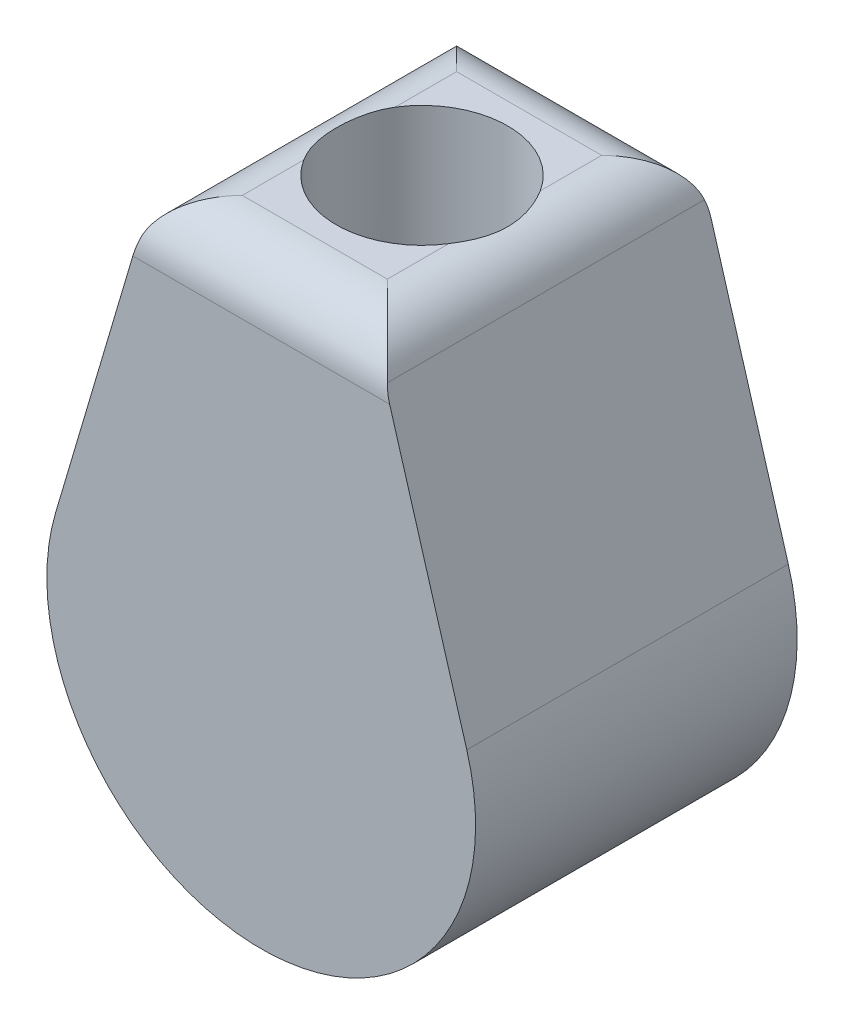
ISO-10303-21;
HEADER;
FILE_DESCRIPTION(('STEP AP214'),'2;1');
FILE_NAME('part.step','',(''),(''),'','','');
FILE_SCHEMA(('AUTOMOTIVE_DESIGN { 1 0 10303 214 1 1 1 1 }'));
ENDSEC;
DATA;
#1=APPLICATION_CONTEXT('core data for automotive mechanical design processes');
#2=APPLICATION_PROTOCOL_DEFINITION('international standard','automotive_design',2000,#1);
#3=PRODUCT_CONTEXT('',#1,'mechanical');
#4=PRODUCT('Part','Part','',(#3));
#5=PRODUCT_RELATED_PRODUCT_CATEGORY('part','',(#4));
#6=PRODUCT_DEFINITION_FORMATION('','',#4);
#7=PRODUCT_DEFINITION_CONTEXT('part definition',#1,'design');
#8=PRODUCT_DEFINITION('design','',#6,#7);
#9=PRODUCT_DEFINITION_SHAPE('','',#8);
#10=(LENGTH_UNIT() NAMED_UNIT(*) SI_UNIT(.MILLI.,.METRE.));
#11=(NAMED_UNIT(*) PLANE_ANGLE_UNIT() SI_UNIT($,.RADIAN.));
#12=(NAMED_UNIT(*) SI_UNIT($,.STERADIAN.) SOLID_ANGLE_UNIT());
#13=UNCERTAINTY_MEASURE_WITH_UNIT(LENGTH_MEASURE(1.E-05),#10,'distance_accuracy_value','');
#14=(GEOMETRIC_REPRESENTATION_CONTEXT(3) GLOBAL_UNCERTAINTY_ASSIGNED_CONTEXT((#13)) GLOBAL_UNIT_ASSIGNED_CONTEXT((#10,
#11,#12)) REPRESENTATION_CONTEXT('',''));
#15=CARTESIAN_POINT('',(0.,0.,0.));
#16=DIRECTION('',(0.,0.,1.));
#17=DIRECTION('',(1.,0.,0.));
#18=AXIS2_PLACEMENT_3D('',#15,#16,#17);
#19=CARTESIAN_POINT('',(1.6,0.,6.));
#20=DIRECTION('',(0.,-1.,0.));
#21=DIRECTION('',(1.,0.,0.));
#22=AXIS2_PLACEMENT_3D('',#19,#20,#21);
#23=PLANE('',#22);
#24=DIRECTION('',(-1.,0.,0.));
#25=VECTOR('',#24,1.);
#26=CARTESIAN_POINT('',(2.1,0.,5.));
#27=LINE('',#26,#25);
#28=CARTESIAN_POINT('',(-1.35305713878644,0.,5.));
#29=VERTEX_POINT('',#28);
#30=CARTESIAN_POINT('',(1.35305713878644,0.,5.));
#31=VERTEX_POINT('',#30);
#32=EDGE_CURVE('E189',#29,#31,#27,.F.);
#33=ORIENTED_EDGE('',*,*,#32,.T.);
#34=DIRECTION('',(0.,0.,-1.));
#35=VECTOR('',#34,1.);
#36=CARTESIAN_POINT('',(1.35305713878644,0.,6.));
#37=LINE('',#36,#35);
#38=CARTESIAN_POINT('',(1.35305713878644,0.,3.85395338232193));
#39=VERTEX_POINT('',#38);
#40=EDGE_CURVE('E193',#31,#39,#37,.T.);
#41=ORIENTED_EDGE('',*,*,#40,.T.);
#42=CARTESIAN_POINT('',(0.,0.,3.));
#43=DIRECTION('',(0.,-1.,0.));
#44=DIRECTION('',(1.,0.,0.));
#45=AXIS2_PLACEMENT_3D('',#42,#43,#44);
#46=CIRCLE('',#45,1.6);
#47=CARTESIAN_POINT('',(-1.35305713878644,0.,3.85395338232193));
#48=VERTEX_POINT('',#47);
#49=EDGE_CURVE('E159',#39,#48,#46,.T.);
#50=ORIENTED_EDGE('',*,*,#49,.T.);
#51=DIRECTION('',(0.,0.,-1.));
#52=VECTOR('',#51,1.);
#53=CARTESIAN_POINT('',(-1.35305713878644,0.,6.));
#54=LINE('',#53,#52);
#55=EDGE_CURVE('E186',#48,#29,#54,.F.);
#56=ORIENTED_EDGE('',*,*,#55,.T.);
#57=EDGE_LOOP('',(#33,#41,#50,#56));
#58=FACE_BOUND('',#57,.T.);
#59=ADVANCED_FACE('F44',(#58),#23,.F.);
#60=CARTESIAN_POINT('',(-1.6,-8.,6.));
#61=DIRECTION('',(0.,-1.,0.));
#62=DIRECTION('',(0.,0.,-1.));
#63=AXIS2_PLACEMENT_3D('',#60,#61,#62);
#64=PLANE('',#63);
#65=CARTESIAN_POINT('',(0.,-8.,3.));
#66=DIRECTION('',(0.,1.,0.));
#67=DIRECTION('',(0.,0.,1.));
#68=AXIS2_PLACEMENT_3D('',#65,#66,#67);
#69=CIRCLE('',#68,1.6);
#70=CARTESIAN_POINT('',(0.,-8.,4.6));
#71=VERTEX_POINT('',#70);
#72=EDGE_CURVE('E265',#71,#71,#69,.T.);
#73=ORIENTED_EDGE('',*,*,#72,.T.);
#74=EDGE_LOOP('',(#73));
#75=FACE_BOUND('',#74,.T.);
#76=ADVANCED_FACE('F236',(#75),#64,.F.);
#77=CARTESIAN_POINT('',(-2.1,0.,6.));
#78=DIRECTION('',(0.958895343820342,-0.283759968282469,0.));
#79=DIRECTION('',(0.283759968282469,0.958895343820342,0.));
#80=AXIS2_PLACEMENT_3D('',#77,#78,#79);
#81=PLANE('',#80);
#82=DIRECTION('',(-0.283759968282469,-0.958895343820342,0.));
#83=VECTOR('',#82,1.);
#84=CARTESIAN_POINT('',(-2.1,0.,6.));
#85=LINE('',#84,#83);
#86=CARTESIAN_POINT('',(-2.39592381495142,-0.999999999999999,6.));
#87=VERTEX_POINT('',#86);
#88=CARTESIAN_POINT('',(-3.83558137528137,-5.86496012687012,6.));
#89=VERTEX_POINT('',#88);
#90=EDGE_CURVE('E123',#87,#89,#85,.T.);
#91=ORIENTED_EDGE('',*,*,#90,.F.);
#92=CARTESIAN_POINT('',(-2.39592381495142,-0.999999999999999,5.));
#93=DIRECTION('',(0.958895343820342,-0.283759968282469,0.));
#94=DIRECTION('',(0.283759968282469,0.958895343820342,0.));
#95=AXIS2_PLACEMENT_3D('',#92,#93,#94);
#96=ELLIPSE('',#95,1.04286667616498,1.);
#97=CARTESIAN_POINT('',(-2.31195248260678,-0.716240031717531,5.95889534382034));
#98=VERTEX_POINT('',#97);
#99=EDGE_CURVE('E174',#87,#98,#96,.F.);
#100=ORIENTED_EDGE('',*,*,#99,.T.);
#101=DIRECTION('',(0.,0.,-1.));
#102=VECTOR('',#101,1.);
#103=CARTESIAN_POINT('',(-2.31195248260678,-0.716240031717531,6.));
#104=LINE('',#103,#102);
#105=CARTESIAN_POINT('',(-2.31195248260678,-0.716240031717531,0.0411046561796576));
#106=VERTEX_POINT('',#105);
#107=EDGE_CURVE('E171',#98,#106,#104,.T.);
#108=ORIENTED_EDGE('',*,*,#107,.T.);
#109=CARTESIAN_POINT('',(-2.39592381495142,-1.,1.));
#110=DIRECTION('',(0.958895343820342,-0.283759968282469,0.));
#111=DIRECTION('',(-0.283759968282469,-0.958895343820342,0.));
#112=AXIS2_PLACEMENT_3D('',#109,#110,#111);
#113=ELLIPSE('',#112,1.04286667616498,1.);
#114=CARTESIAN_POINT('',(-2.39592381495142,-1.,0.));
#115=VERTEX_POINT('',#114);
#116=EDGE_CURVE('E168',#106,#115,#113,.F.);
#117=ORIENTED_EDGE('',*,*,#116,.T.);
#118=DIRECTION('',(-0.283759968282469,-0.958895343820342,0.));
#119=VECTOR('',#118,1.);
#120=CARTESIAN_POINT('',(-2.1,0.,0.));
#121=LINE('',#120,#119);
#122=CARTESIAN_POINT('',(-3.83558137528137,-5.86496012687012,0.));
#123=VERTEX_POINT('',#122);
#124=EDGE_CURVE('E140',#115,#123,#121,.T.);
#125=ORIENTED_EDGE('',*,*,#124,.T.);
#126=DIRECTION('',(0.,0.,-1.));
#127=VECTOR('',#126,1.);
#128=CARTESIAN_POINT('',(-3.83558137528137,-5.86496012687012,6.));
#129=LINE('',#128,#127);
#130=EDGE_CURVE('E137',#89,#123,#129,.T.);
#131=ORIENTED_EDGE('',*,*,#130,.F.);
#132=EDGE_LOOP('',(#91,#100,#108,#117,#125,#131));
#133=FACE_BOUND('',#132,.T.);
#134=ADVANCED_FACE('F138',(#133),#81,.F.);
#135=CARTESIAN_POINT('',(0.,-7.,6.));
#136=DIRECTION('',(0.,0.,-1.));
#137=DIRECTION('',(-1.,0.,0.));
#138=AXIS2_PLACEMENT_3D('',#135,#136,#137);
#139=CYLINDRICAL_SURFACE('',#138,4.);
#140=CARTESIAN_POINT('',(0.,-7.,0.));
#141=DIRECTION('',(0.,0.,1.));
#142=DIRECTION('',(1.,0.,0.));
#143=AXIS2_PLACEMENT_3D('',#140,#141,#142);
#144=CIRCLE('',#143,4.);
#145=CARTESIAN_POINT('',(3.83558137528137,-5.86496012687012,0.));
#146=VERTEX_POINT('',#145);
#147=EDGE_CURVE('E158',#123,#146,#144,.T.);
#148=ORIENTED_EDGE('',*,*,#147,.T.);
#149=DIRECTION('',(0.,0.,-1.));
#150=VECTOR('',#149,1.);
#151=CARTESIAN_POINT('',(3.83558137528137,-5.86496012687012,6.));
#152=LINE('',#151,#150);
#153=CARTESIAN_POINT('',(3.83558137528137,-5.86496012687012,6.));
#154=VERTEX_POINT('',#153);
#155=EDGE_CURVE('E144',#154,#146,#152,.T.);
#156=ORIENTED_EDGE('',*,*,#155,.F.);
#157=CARTESIAN_POINT('',(0.,-7.,6.));
#158=DIRECTION('',(0.,0.,1.));
#159=DIRECTION('',(1.,0.,0.));
#160=AXIS2_PLACEMENT_3D('',#157,#158,#159);
#161=CIRCLE('',#160,4.);
#162=EDGE_CURVE('E128',#89,#154,#161,.T.);
#163=ORIENTED_EDGE('',*,*,#162,.F.);
#164=ORIENTED_EDGE('',*,*,#130,.T.);
#165=EDGE_LOOP('',(#148,#156,#163,#164));
#166=FACE_BOUND('',#165,.T.);
#167=ADVANCED_FACE('F146',(#166),#139,.T.);
#168=CARTESIAN_POINT('',(2.1,0.,6.));
#169=DIRECTION('',(-0.958895343820342,-0.283759968282469,0.));
#170=DIRECTION('',(0.283759968282469,-0.958895343820342,0.));
#171=AXIS2_PLACEMENT_3D('',#168,#169,#170);
#172=PLANE('',#171);
#173=DIRECTION('',(0.,0.,-1.));
#174=VECTOR('',#173,1.);
#175=CARTESIAN_POINT('',(2.31195248260678,-0.71624003171753,6.));
#176=LINE('',#175,#174);
#177=CARTESIAN_POINT('',(2.31195248260678,-0.71624003171753,0.0411046561796576));
#178=VERTEX_POINT('',#177);
#179=CARTESIAN_POINT('',(2.31195248260678,-0.71624003171753,5.95889534382034));
#180=VERTEX_POINT('',#179);
#181=EDGE_CURVE('E62',#178,#180,#176,.F.);
#182=ORIENTED_EDGE('',*,*,#181,.T.);
#183=CARTESIAN_POINT('',(2.39592381495142,-0.999999999999999,5.));
#184=DIRECTION('',(-0.958895343820342,-0.283759968282469,0.));
#185=DIRECTION('',(0.283759968282469,-0.958895343820342,0.));
#186=AXIS2_PLACEMENT_3D('',#183,#184,#185);
#187=ELLIPSE('',#186,1.04286667616498,1.);
#188=CARTESIAN_POINT('',(2.39592381495142,-0.999999999999999,6.));
#189=VERTEX_POINT('',#188);
#190=EDGE_CURVE('E200',#180,#189,#187,.F.);
#191=ORIENTED_EDGE('',*,*,#190,.T.);
#192=DIRECTION('',(-0.283759968282469,0.958895343820342,0.));
#193=VECTOR('',#192,1.);
#194=CARTESIAN_POINT('',(2.1,0.,6.));
#195=LINE('',#194,#193);
#196=EDGE_CURVE('E150',#154,#189,#195,.T.);
#197=ORIENTED_EDGE('',*,*,#196,.F.);
#198=ORIENTED_EDGE('',*,*,#155,.T.);
#199=DIRECTION('',(-0.283759968282469,0.958895343820342,0.));
#200=VECTOR('',#199,1.);
#201=CARTESIAN_POINT('',(2.1,0.,0.));
#202=LINE('',#201,#200);
#203=CARTESIAN_POINT('',(2.39592381495142,-1.,0.));
#204=VERTEX_POINT('',#203);
#205=EDGE_CURVE('E134',#146,#204,#202,.T.);
#206=ORIENTED_EDGE('',*,*,#205,.T.);
#207=CARTESIAN_POINT('',(2.39592381495142,-1.,1.));
#208=DIRECTION('',(-0.958895343820342,-0.283759968282469,0.));
#209=DIRECTION('',(-0.283759968282469,0.958895343820342,0.));
#210=AXIS2_PLACEMENT_3D('',#207,#208,#209);
#211=ELLIPSE('',#210,1.04286667616498,1.);
#212=EDGE_CURVE('E67',#204,#178,#211,.F.);
#213=ORIENTED_EDGE('',*,*,#212,.T.);
#214=EDGE_LOOP('',(#182,#191,#197,#198,#206,#213));
#215=FACE_BOUND('',#214,.T.);
#216=ADVANCED_FACE('F249',(#215),#172,.F.);
#217=CARTESIAN_POINT('',(-1.35305713878644,0.,2.14604661767807));
#218=VERTEX_POINT('',#217);
#219=CARTESIAN_POINT('',(1.35305713878644,0.,2.14604661767807));
#220=VERTEX_POINT('',#219);
#221=EDGE_CURVE('E258',#218,#220,#46,.T.);
#222=ORIENTED_EDGE('',*,*,#221,.T.);
#223=DIRECTION('',(0.,0.,-1.));
#224=VECTOR('',#223,1.);
#225=CARTESIAN_POINT('',(1.35305713878644,0.,6.));
#226=LINE('',#225,#224);
#227=CARTESIAN_POINT('',(1.35305713878644,0.,1.));
#228=VERTEX_POINT('',#227);
#229=EDGE_CURVE('E183',#220,#228,#226,.T.);
#230=ORIENTED_EDGE('',*,*,#229,.T.);
#231=DIRECTION('',(-1.,0.,0.));
#232=VECTOR('',#231,1.);
#233=CARTESIAN_POINT('',(1.6,0.,1.));
#234=LINE('',#233,#232);
#235=CARTESIAN_POINT('',(-1.35305713878644,0.,1.));
#236=VERTEX_POINT('',#235);
#237=EDGE_CURVE('E177',#228,#236,#234,.T.);
#238=ORIENTED_EDGE('',*,*,#237,.T.);
#239=DIRECTION('',(0.,0.,-1.));
#240=VECTOR('',#239,1.);
#241=CARTESIAN_POINT('',(-1.35305713878644,0.,6.));
#242=LINE('',#241,#240);
#243=EDGE_CURVE('E180',#236,#218,#242,.F.);
#244=ORIENTED_EDGE('',*,*,#243,.T.);
#245=EDGE_LOOP('',(#222,#230,#238,#244));
#246=FACE_BOUND('',#245,.T.);
#247=ADVANCED_FACE('F239',(#246),#23,.F.);
#248=CARTESIAN_POINT('',(0.,-7.,6.));
#249=DIRECTION('',(0.,0.,1.));
#250=DIRECTION('',(1.,0.,0.));
#251=AXIS2_PLACEMENT_3D('',#248,#249,#250);
#252=PLANE('',#251);
#253=ORIENTED_EDGE('',*,*,#196,.T.);
#254=DIRECTION('',(-1.,0.,0.));
#255=VECTOR('',#254,1.);
#256=CARTESIAN_POINT('',(-2.1,-0.999999999999999,6.));
#257=LINE('',#256,#255);
#258=EDGE_CURVE('E131',#189,#87,#257,.T.);
#259=ORIENTED_EDGE('',*,*,#258,.T.);
#260=ORIENTED_EDGE('',*,*,#90,.T.);
#261=ORIENTED_EDGE('',*,*,#162,.T.);
#262=EDGE_LOOP('',(#253,#259,#260,#261));
#263=FACE_BOUND('',#262,.T.);
#264=ADVANCED_FACE('F126',(#263),#252,.T.);
#265=CARTESIAN_POINT('',(0.,-7.,0.));
#266=DIRECTION('',(0.,0.,1.));
#267=DIRECTION('',(1.,0.,0.));
#268=AXIS2_PLACEMENT_3D('',#265,#266,#267);
#269=PLANE('',#268);
#270=ORIENTED_EDGE('',*,*,#124,.F.);
#271=DIRECTION('',(-1.,0.,0.));
#272=VECTOR('',#271,1.);
#273=CARTESIAN_POINT('',(0.,-0.999999999999999,0.));
#274=LINE('',#273,#272);
#275=EDGE_CURVE('E11',#115,#204,#274,.F.);
#276=ORIENTED_EDGE('',*,*,#275,.T.);
#277=ORIENTED_EDGE('',*,*,#205,.F.);
#278=ORIENTED_EDGE('',*,*,#147,.F.);
#279=EDGE_LOOP('',(#270,#276,#277,#278));
#280=FACE_BOUND('',#279,.T.);
#281=ADVANCED_FACE('F255',(#280),#269,.F.);
#282=CARTESIAN_POINT('',(0.,4.38634243989226,3.));
#283=DIRECTION('',(0.,-1.,0.));
#284=DIRECTION('',(1.,0.,0.));
#285=AXIS2_PLACEMENT_3D('',#282,#283,#284);
#286=CYLINDRICAL_SURFACE('',#285,1.6);
#287=ORIENTED_EDGE('',*,*,#72,.F.);
#288=EDGE_LOOP('',(#287));
#289=FACE_BOUND('',#288,.T.);
#290=ORIENTED_EDGE('',*,*,#49,.F.);
#291=CARTESIAN_POINT('',(1.35305713878644,0.,3.85395338232193));
#292=CARTESIAN_POINT('',(1.37570076684839,-9.53045621501494E-06,3.81808160588351));
#293=CARTESIAN_POINT('',(1.39690325497435,-0.000768999835214293,3.78132001395776));
#294=CARTESIAN_POINT('',(1.43630612484967,-0.0032733772002761,3.70627018919517));
#295=CARTESIAN_POINT('',(1.45450769550025,-0.00501789371318118,3.66798256844068));
#296=CARTESIAN_POINT('',(1.48781856953981,-0.00898011825730259,3.59007790349631));
#297=CARTESIAN_POINT('',(1.50292572784003,-0.0111981523766956,3.55045995910339));
#298=CARTESIAN_POINT('',(1.52994996539505,-0.0156756536905779,3.47015996524693));
#299=CARTESIAN_POINT('',(1.54186668252565,-0.0179351255572976,3.42947779556554));
#300=CARTESIAN_POINT('',(1.57363344648718,-0.0243736893075418,3.3024859467427));
#301=CARTESIAN_POINT('',(1.58800640288033,-0.027966323359061,3.214696081078));
#302=CARTESIAN_POINT('',(1.60200351015844,-0.031455151552588,3.03796327968133));
#303=CARTESIAN_POINT('',(1.6016377776277,-0.031353881182145,2.94902117675904));
#304=CARTESIAN_POINT('',(1.58627621511468,-0.0275461471660546,2.77312154109627));
#305=CARTESIAN_POINT('',(1.57138010864585,-0.0238642582106814,2.6861546142297));
#306=CARTESIAN_POINT('',(1.52754259715676,-0.0150897084323428,2.51592429255373));
#307=CARTESIAN_POINT('',(1.49860837489121,-0.00999776964800334,2.43265902750683));
#308=CARTESIAN_POINT('',(1.4472665877008,-0.00432313828283756,2.31666486979832));
#309=CARTESIAN_POINT('',(1.43016476450945,-0.0028069553516247,2.28156157758232));
#310=CARTESIAN_POINT('',(1.39346474108047,-0.000648485603973461,2.21274375681162));
#311=CARTESIAN_POINT('',(1.37387128799555,-4.56341899554579E-06,2.17902674463136));
#312=CARTESIAN_POINT('',(1.35305713878644,0.,2.14604661767807));
#313=B_SPLINE_CURVE_WITH_KNOTS('',3,(#291,#292,#293,#294,#295,#296,#297,#298,#299,#300,#301,
#302,#303,#304,#305,#306,#307,#308,#309,#310,#311,#312),.UNSPECIFIED.,.F.,.F.,(4,2,2,2,2,2,2,2,
2,2,4),(0.,0.127198127402648,0.254345739820157,0.381581196602572,0.508831088856912,
0.774544493581811,1.04007551666759,1.30379690204821,1.56738349358779,1.68451923399984,
1.80143505568336),.UNSPECIFIED.);
#314=EDGE_CURVE('E54',#39,#220,#313,.T.);
#315=ORIENTED_EDGE('',*,*,#314,.T.);
#316=ORIENTED_EDGE('',*,*,#221,.F.);
#317=CARTESIAN_POINT('',(-1.35305713878644,0.,2.14604661767807));
#318=CARTESIAN_POINT('',(-1.37570076684839,-9.53045621538372E-06,2.18191839411649));
#319=CARTESIAN_POINT('',(-1.39690325497435,-0.000768999835214666,2.21867998604224));
#320=CARTESIAN_POINT('',(-1.43630612484967,-0.00327337720027648,2.29372981080483));
#321=CARTESIAN_POINT('',(-1.45450769550025,-0.00501789371318155,2.33201743155932));
#322=CARTESIAN_POINT('',(-1.48781856953981,-0.00898011825730303,2.40992209650369));
#323=CARTESIAN_POINT('',(-1.50292572784003,-0.0111981523766961,2.44954004089661));
#324=CARTESIAN_POINT('',(-1.52994996539505,-0.0156756536905785,2.52984003475307));
#325=CARTESIAN_POINT('',(-1.54186668252565,-0.0179351255572981,2.57052220443446));
#326=CARTESIAN_POINT('',(-1.57363344648718,-0.0243736893075423,2.6975140532573));
#327=CARTESIAN_POINT('',(-1.58800640288033,-0.0279663233590616,2.785303918922));
#328=CARTESIAN_POINT('',(-1.60200351015844,-0.0314551515525887,2.96203672031867));
#329=CARTESIAN_POINT('',(-1.6016377776277,-0.0313538811821458,3.05097882324095));
#330=CARTESIAN_POINT('',(-1.58627621511469,-0.0275461471660554,3.22687845890373));
#331=CARTESIAN_POINT('',(-1.57138010864585,-0.0238642582106822,3.3138453857703));
#332=CARTESIAN_POINT('',(-1.52754259715676,-0.0150897084323437,3.48407570744627));
#333=CARTESIAN_POINT('',(-1.49860837489121,-0.00999776964800421,3.56734097249317));
#334=CARTESIAN_POINT('',(-1.4472665877008,-0.00432313828283832,3.68333513020168));
#335=CARTESIAN_POINT('',(-1.43016476450946,-0.0028069553516254,3.71843842241768));
#336=CARTESIAN_POINT('',(-1.39346474108047,-0.000648485603974057,3.78725624318838));
#337=CARTESIAN_POINT('',(-1.37387128799555,-4.56341899608802E-06,3.82097325536864));
#338=CARTESIAN_POINT('',(-1.35305713878644,0.,3.85395338232193));
#339=B_SPLINE_CURVE_WITH_KNOTS('',3,(#317,#318,#319,#320,#321,#322,#323,#324,#325,#326,#327,
#328,#329,#330,#331,#332,#333,#334,#335,#336,#337,#338),.UNSPECIFIED.,.F.,.F.,(4,2,2,2,2,2,2,2,
2,2,4),(0.,0.127198127402648,0.254345739820157,0.381581196602571,0.508831088856911,
0.774544493581811,1.04007551666759,1.30379690204821,1.56738349358779,1.68451923399984,
1.80143505568337),.UNSPECIFIED.);
#340=EDGE_CURVE('E203',#218,#48,#339,.T.);
#341=ORIENTED_EDGE('',*,*,#340,.T.);
#342=EDGE_LOOP('',(#290,#315,#316,#341));
#343=FACE_BOUND('',#342,.T.);
#344=ADVANCED_FACE('F216',(#289,#343),#286,.F.);
#345=CARTESIAN_POINT('',(1.6,-1.,1.));
#346=DIRECTION('',(-1.,0.,0.));
#347=DIRECTION('',(0.,-1.,0.));
#348=AXIS2_PLACEMENT_3D('',#345,#346,#347);
#349=CYLINDRICAL_SURFACE('',#348,1.);
#350=CARTESIAN_POINT('',(-1.35305713878644,-1.,1.));
#351=DIRECTION('',(-0.707106781186548,0.,0.707106781186547));
#352=DIRECTION('',(-0.707106781186548,0.,-0.707106781186547));
#353=AXIS2_PLACEMENT_3D('',#350,#351,#352);
#354=ELLIPSE('',#353,1.41421356237309,1.);
#355=EDGE_CURVE('E270',#236,#106,#354,.T.);
#356=ORIENTED_EDGE('',*,*,#355,.F.);
#357=ORIENTED_EDGE('',*,*,#237,.F.);
#358=CARTESIAN_POINT('',(1.35305713878644,-1.,1.));
#359=DIRECTION('',(-0.707106781186548,0.,-0.707106781186547));
#360=DIRECTION('',(-0.707106781186548,0.,0.707106781186547));
#361=AXIS2_PLACEMENT_3D('',#358,#359,#360);
#362=ELLIPSE('',#361,1.41421356237309,1.);
#363=EDGE_CURVE('E48',#178,#228,#362,.F.);
#364=ORIENTED_EDGE('',*,*,#363,.F.);
#365=ORIENTED_EDGE('',*,*,#212,.F.);
#366=ORIENTED_EDGE('',*,*,#275,.F.);
#367=ORIENTED_EDGE('',*,*,#116,.F.);
#368=EDGE_LOOP('',(#356,#357,#364,#365,#366,#367));
#369=FACE_BOUND('',#368,.T.);
#370=ADVANCED_FACE('F46',(#369),#349,.T.);
#371=CARTESIAN_POINT('',(1.35305713878644,-1.,6.));
#372=DIRECTION('',(0.,0.,-1.));
#373=DIRECTION('',(-1.,0.,0.));
#374=AXIS2_PLACEMENT_3D('',#371,#372,#373);
#375=CYLINDRICAL_SURFACE('',#374,1.);
#376=ORIENTED_EDGE('',*,*,#314,.F.);
#377=ORIENTED_EDGE('',*,*,#40,.F.);
#378=CARTESIAN_POINT('',(1.35305713878644,-0.999999999999999,5.));
#379=DIRECTION('',(0.707106781186548,0.,-0.707106781186547));
#380=DIRECTION('',(-0.707106781186548,0.,-0.707106781186547));
#381=AXIS2_PLACEMENT_3D('',#378,#379,#380);
#382=ELLIPSE('',#381,1.41421356237309,1.);
#383=EDGE_CURVE('E275',#180,#31,#382,.F.);
#384=ORIENTED_EDGE('',*,*,#383,.F.);
#385=ORIENTED_EDGE('',*,*,#181,.F.);
#386=ORIENTED_EDGE('',*,*,#363,.T.);
#387=ORIENTED_EDGE('',*,*,#229,.F.);
#388=EDGE_LOOP('',(#376,#377,#384,#385,#386,#387));
#389=FACE_BOUND('',#388,.T.);
#390=ADVANCED_FACE('F224',(#389),#375,.T.);
#391=CARTESIAN_POINT('',(-1.35305713878644,-1.,6.));
#392=DIRECTION('',(0.,0.,-1.));
#393=DIRECTION('',(-1.,0.,0.));
#394=AXIS2_PLACEMENT_3D('',#391,#392,#393);
#395=CYLINDRICAL_SURFACE('',#394,1.);
#396=ORIENTED_EDGE('',*,*,#355,.T.);
#397=ORIENTED_EDGE('',*,*,#107,.F.);
#398=CARTESIAN_POINT('',(-1.35305713878644,-1.,5.));
#399=DIRECTION('',(-0.707106781186548,0.,-0.707106781186547));
#400=DIRECTION('',(0.707106781186548,0.,-0.707106781186547));
#401=AXIS2_PLACEMENT_3D('',#398,#399,#400);
#402=ELLIPSE('',#401,1.41421356237309,1.);
#403=EDGE_CURVE('E279',#29,#98,#402,.F.);
#404=ORIENTED_EDGE('',*,*,#403,.F.);
#405=ORIENTED_EDGE('',*,*,#55,.F.);
#406=ORIENTED_EDGE('',*,*,#340,.F.);
#407=ORIENTED_EDGE('',*,*,#243,.F.);
#408=EDGE_LOOP('',(#396,#397,#404,#405,#406,#407));
#409=FACE_BOUND('',#408,.T.);
#410=ADVANCED_FACE('F219',(#409),#395,.T.);
#411=CARTESIAN_POINT('',(0.,-0.999999999999999,5.));
#412=DIRECTION('',(1.,0.,0.));
#413=DIRECTION('',(0.,1.,0.));
#414=AXIS2_PLACEMENT_3D('',#411,#412,#413);
#415=CYLINDRICAL_SURFACE('',#414,1.);
#416=ORIENTED_EDGE('',*,*,#383,.T.);
#417=ORIENTED_EDGE('',*,*,#32,.F.);
#418=ORIENTED_EDGE('',*,*,#403,.T.);
#419=ORIENTED_EDGE('',*,*,#99,.F.);
#420=ORIENTED_EDGE('',*,*,#258,.F.);
#421=ORIENTED_EDGE('',*,*,#190,.F.);
#422=EDGE_LOOP('',(#416,#417,#418,#419,#420,#421));
#423=FACE_BOUND('',#422,.T.);
#424=ADVANCED_FACE('F223',(#423),#415,.T.);
#425=CLOSED_SHELL('',(#59,#76,#134,#167,#216,#247,#264,#281,#344,#370,#390,#410,#424));
#426=MANIFOLD_SOLID_BREP('B2',#425);
#427=ADVANCED_BREP_SHAPE_REPRESENTATION('',(#18,#426),#14);
#428=SHAPE_DEFINITION_REPRESENTATION(#9,#427);
ENDSEC;
END-ISO-10303-21;
